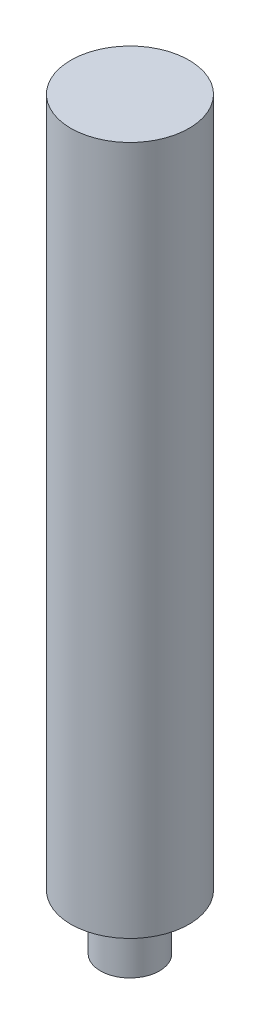
ISO-10303-21;
HEADER;
FILE_DESCRIPTION(('STEP AP214'),'2;1');
FILE_NAME('part.step','',(''),(''),'','','');
FILE_SCHEMA(('AUTOMOTIVE_DESIGN { 1 0 10303 214 1 1 1 1 }'));
ENDSEC;
DATA;
#1=APPLICATION_CONTEXT('core data for automotive mechanical design processes');
#2=APPLICATION_PROTOCOL_DEFINITION('international standard','automotive_design',2000,#1);
#3=PRODUCT_CONTEXT('',#1,'mechanical');
#4=PRODUCT('Part','Part','',(#3));
#5=PRODUCT_RELATED_PRODUCT_CATEGORY('part','',(#4));
#6=PRODUCT_DEFINITION_FORMATION('','',#4);
#7=PRODUCT_DEFINITION_CONTEXT('part definition',#1,'design');
#8=PRODUCT_DEFINITION('design','',#6,#7);
#9=PRODUCT_DEFINITION_SHAPE('','',#8);
#10=(LENGTH_UNIT() NAMED_UNIT(*) SI_UNIT(.MILLI.,.METRE.));
#11=(NAMED_UNIT(*) PLANE_ANGLE_UNIT() SI_UNIT($,.RADIAN.));
#12=(NAMED_UNIT(*) SI_UNIT($,.STERADIAN.) SOLID_ANGLE_UNIT());
#13=UNCERTAINTY_MEASURE_WITH_UNIT(LENGTH_MEASURE(1.E-05),#10,'distance_accuracy_value','');
#14=(GEOMETRIC_REPRESENTATION_CONTEXT(3) GLOBAL_UNCERTAINTY_ASSIGNED_CONTEXT((#13)) GLOBAL_UNIT_ASSIGNED_CONTEXT((#10,
#11,#12)) REPRESENTATION_CONTEXT('',''));
#15=CARTESIAN_POINT('',(0.,0.,0.));
#16=DIRECTION('',(0.,0.,1.));
#17=DIRECTION('',(1.,0.,0.));
#18=AXIS2_PLACEMENT_3D('',#15,#16,#17);
#19=CARTESIAN_POINT('',(0.,2.8,0.));
#20=DIRECTION('',(0.,-1.,0.));
#21=DIRECTION('',(0.,0.,-1.));
#22=AXIS2_PLACEMENT_3D('',#19,#20,#21);
#23=CYLINDRICAL_SURFACE('',#22,1.5);
#24=CARTESIAN_POINT('',(0.,2.8,0.));
#25=DIRECTION('',(0.,1.,0.));
#26=DIRECTION('',(0.,0.,1.));
#27=AXIS2_PLACEMENT_3D('',#24,#25,#26);
#28=CIRCLE('',#27,1.5);
#29=CARTESIAN_POINT('',(0.,2.8,1.5));
#30=VERTEX_POINT('',#29);
#31=EDGE_CURVE('E10',#30,#30,#28,.T.);
#32=ORIENTED_EDGE('',*,*,#31,.F.);
#33=EDGE_LOOP('',(#32));
#34=FACE_BOUND('',#33,.T.);
#35=CARTESIAN_POINT('',(0.,0.,0.));
#36=DIRECTION('',(0.,1.,0.));
#37=DIRECTION('',(0.,0.,1.));
#38=AXIS2_PLACEMENT_3D('',#35,#36,#37);
#39=CIRCLE('',#38,1.5);
#40=CARTESIAN_POINT('',(0.,0.,1.5));
#41=VERTEX_POINT('',#40);
#42=EDGE_CURVE('E42',#41,#41,#39,.T.);
#43=ORIENTED_EDGE('',*,*,#42,.T.);
#44=EDGE_LOOP('',(#43));
#45=FACE_BOUND('',#44,.T.);
#46=ADVANCED_FACE('F39',(#34,#45),#23,.T.);
#47=CARTESIAN_POINT('',(0.,0.,0.));
#48=DIRECTION('',(0.,1.,0.));
#49=DIRECTION('',(0.,0.,1.));
#50=AXIS2_PLACEMENT_3D('',#47,#48,#49);
#51=PLANE('',#50);
#52=ORIENTED_EDGE('',*,*,#42,.F.);
#53=EDGE_LOOP('',(#52));
#54=FACE_BOUND('',#53,.T.);
#55=ADVANCED_FACE('F66',(#54),#51,.F.);
#56=CARTESIAN_POINT('',(0.,37.8,0.));
#57=DIRECTION('',(0.,-1.,0.));
#58=DIRECTION('',(0.,0.,-1.));
#59=AXIS2_PLACEMENT_3D('',#56,#57,#58);
#60=CYLINDRICAL_SURFACE('',#59,3.);
#61=CARTESIAN_POINT('',(0.,37.8,0.));
#62=DIRECTION('',(0.,1.,0.));
#63=DIRECTION('',(0.,0.,1.));
#64=AXIS2_PLACEMENT_3D('',#61,#62,#63);
#65=CIRCLE('',#64,3.);
#66=CARTESIAN_POINT('',(0.,37.8,3.));
#67=VERTEX_POINT('',#66);
#68=EDGE_CURVE('E51',#67,#67,#65,.T.);
#69=ORIENTED_EDGE('',*,*,#68,.F.);
#70=EDGE_LOOP('',(#69));
#71=FACE_BOUND('',#70,.T.);
#72=CARTESIAN_POINT('',(0.,2.8,0.));
#73=DIRECTION('',(0.,1.,0.));
#74=DIRECTION('',(0.,0.,1.));
#75=AXIS2_PLACEMENT_3D('',#72,#73,#74);
#76=CIRCLE('',#75,3.);
#77=CARTESIAN_POINT('',(0.,2.8,3.));
#78=VERTEX_POINT('',#77);
#79=EDGE_CURVE('E53',#78,#78,#76,.T.);
#80=ORIENTED_EDGE('',*,*,#79,.T.);
#81=EDGE_LOOP('',(#80));
#82=FACE_BOUND('',#81,.T.);
#83=ADVANCED_FACE('F63',(#71,#82),#60,.T.);
#84=CARTESIAN_POINT('',(0.,37.8,0.));
#85=DIRECTION('',(0.,1.,0.));
#86=DIRECTION('',(0.,0.,1.));
#87=AXIS2_PLACEMENT_3D('',#84,#85,#86);
#88=PLANE('',#87);
#89=ORIENTED_EDGE('',*,*,#68,.T.);
#90=EDGE_LOOP('',(#89));
#91=FACE_BOUND('',#90,.T.);
#92=ADVANCED_FACE('F61',(#91),#88,.T.);
#93=CARTESIAN_POINT('',(0.,2.8,0.));
#94=DIRECTION('',(0.,1.,0.));
#95=DIRECTION('',(0.,0.,1.));
#96=AXIS2_PLACEMENT_3D('',#93,#94,#95);
#97=PLANE('',#96);
#98=ORIENTED_EDGE('',*,*,#31,.T.);
#99=EDGE_LOOP('',(#98));
#100=FACE_BOUND('',#99,.T.);
#101=ORIENTED_EDGE('',*,*,#79,.F.);
#102=EDGE_LOOP('',(#101));
#103=FACE_BOUND('',#102,.T.);
#104=ADVANCED_FACE('F70',(#100,#103),#97,.F.);
#105=CLOSED_SHELL('',(#46,#55,#83,#92,#104));
#106=MANIFOLD_SOLID_BREP('B2',#105);
#107=ADVANCED_BREP_SHAPE_REPRESENTATION('',(#18,#106),#14);
#108=SHAPE_DEFINITION_REPRESENTATION(#9,#107);
ENDSEC;
END-ISO-10303-21;
